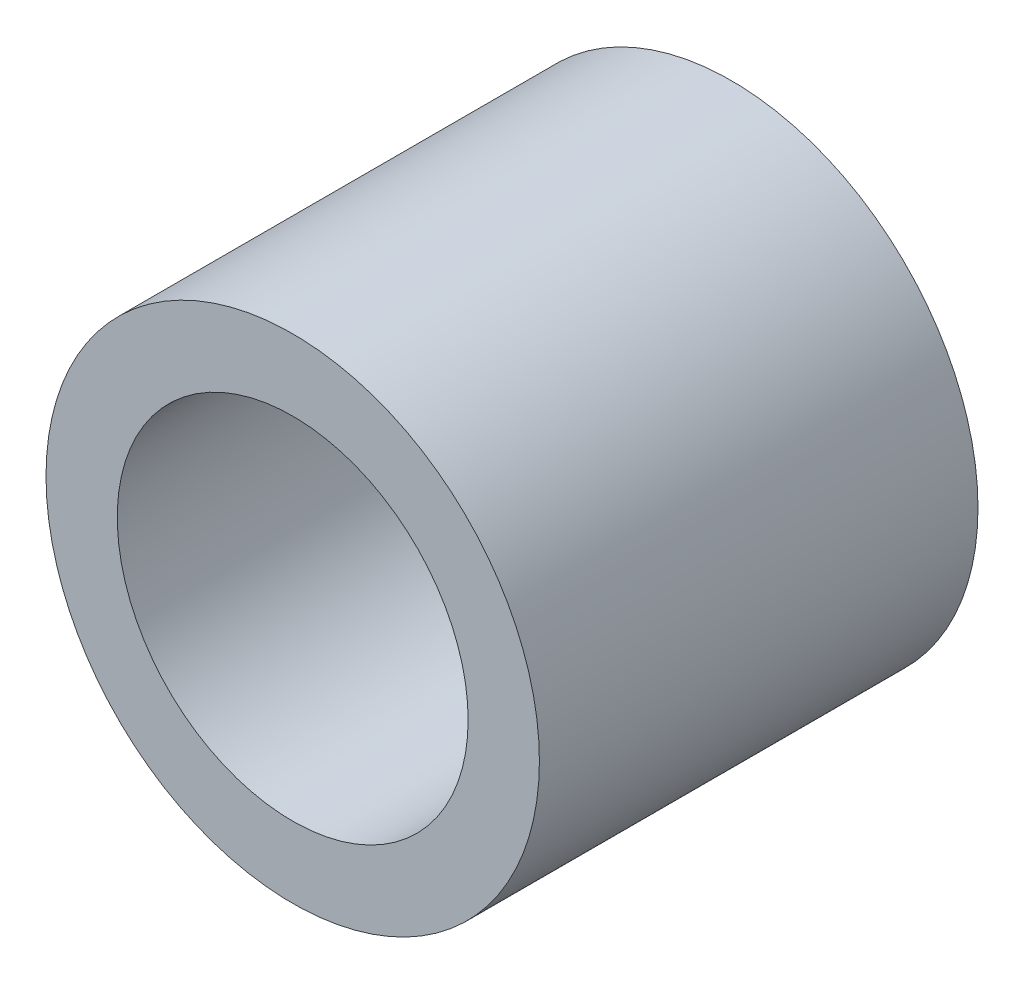
ISO-10303-21;
HEADER;
FILE_DESCRIPTION(('STEP AP214'),'2;1');
FILE_NAME('part.step','',(''),(''),'','','');
FILE_SCHEMA(('AUTOMOTIVE_DESIGN { 1 0 10303 214 1 1 1 1 }'));
ENDSEC;
DATA;
#1=APPLICATION_CONTEXT('core data for automotive mechanical design processes');
#2=APPLICATION_PROTOCOL_DEFINITION('international standard','automotive_design',2000,#1);
#3=PRODUCT_CONTEXT('',#1,'mechanical');
#4=PRODUCT('Part','Part','',(#3));
#5=PRODUCT_RELATED_PRODUCT_CATEGORY('part','',(#4));
#6=PRODUCT_DEFINITION_FORMATION('','',#4);
#7=PRODUCT_DEFINITION_CONTEXT('part definition',#1,'design');
#8=PRODUCT_DEFINITION('design','',#6,#7);
#9=PRODUCT_DEFINITION_SHAPE('','',#8);
#10=(LENGTH_UNIT() NAMED_UNIT(*) SI_UNIT(.MILLI.,.METRE.));
#11=(NAMED_UNIT(*) PLANE_ANGLE_UNIT() SI_UNIT($,.RADIAN.));
#12=(NAMED_UNIT(*) SI_UNIT($,.STERADIAN.) SOLID_ANGLE_UNIT());
#13=UNCERTAINTY_MEASURE_WITH_UNIT(LENGTH_MEASURE(1.E-05),#10,'distance_accuracy_value','');
#14=(GEOMETRIC_REPRESENTATION_CONTEXT(3) GLOBAL_UNCERTAINTY_ASSIGNED_CONTEXT((#13)) GLOBAL_UNIT_ASSIGNED_CONTEXT((#10,
#11,#12)) REPRESENTATION_CONTEXT('',''));
#15=CARTESIAN_POINT('',(0.,0.,0.));
#16=DIRECTION('',(0.,0.,1.));
#17=DIRECTION('',(1.,0.,0.));
#18=AXIS2_PLACEMENT_3D('',#15,#16,#17);
#19=CARTESIAN_POINT('',(0.,0.,4.));
#20=DIRECTION('',(0.,0.,1.));
#21=DIRECTION('',(1.,0.,0.));
#22=AXIS2_PLACEMENT_3D('',#19,#20,#21);
#23=PLANE('',#22);
#24=CARTESIAN_POINT('',(0.,0.,4.));
#25=DIRECTION('',(0.,0.,1.));
#26=DIRECTION('',(1.,0.,0.));
#27=AXIS2_PLACEMENT_3D('',#24,#25,#26);
#28=CIRCLE('',#27,2.25);
#29=CARTESIAN_POINT('',(2.25,0.,4.));
#30=VERTEX_POINT('',#29);
#31=EDGE_CURVE('E10',#30,#30,#28,.T.);
#32=ORIENTED_EDGE('',*,*,#31,.T.);
#33=EDGE_LOOP('',(#32));
#34=FACE_BOUND('',#33,.T.);
#35=CARTESIAN_POINT('',(0.,0.,4.));
#36=DIRECTION('',(0.,0.,1.));
#37=DIRECTION('',(1.,0.,0.));
#38=AXIS2_PLACEMENT_3D('',#35,#36,#37);
#39=CIRCLE('',#38,1.6);
#40=CARTESIAN_POINT('',(1.6,0.,4.));
#41=VERTEX_POINT('',#40);
#42=EDGE_CURVE('E42',#41,#41,#39,.T.);
#43=ORIENTED_EDGE('',*,*,#42,.F.);
#44=EDGE_LOOP('',(#43));
#45=FACE_BOUND('',#44,.T.);
#46=ADVANCED_FACE('F31',(#34,#45),#23,.T.);
#47=CARTESIAN_POINT('',(0.,0.,0.));
#48=DIRECTION('',(0.,0.,1.));
#49=DIRECTION('',(1.,0.,0.));
#50=AXIS2_PLACEMENT_3D('',#47,#48,#49);
#51=PLANE('',#50);
#52=CARTESIAN_POINT('',(0.,0.,0.));
#53=DIRECTION('',(0.,0.,1.));
#54=DIRECTION('',(1.,0.,0.));
#55=AXIS2_PLACEMENT_3D('',#52,#53,#54);
#56=CIRCLE('',#55,2.25);
#57=CARTESIAN_POINT('',(2.25,0.,0.));
#58=VERTEX_POINT('',#57);
#59=EDGE_CURVE('E35',#58,#58,#56,.T.);
#60=ORIENTED_EDGE('',*,*,#59,.F.);
#61=EDGE_LOOP('',(#60));
#62=FACE_BOUND('',#61,.T.);
#63=CARTESIAN_POINT('',(0.,0.,0.));
#64=DIRECTION('',(0.,0.,1.));
#65=DIRECTION('',(1.,0.,0.));
#66=AXIS2_PLACEMENT_3D('',#63,#64,#65);
#67=CIRCLE('',#66,1.6);
#68=CARTESIAN_POINT('',(1.6,0.,0.));
#69=VERTEX_POINT('',#68);
#70=EDGE_CURVE('E44',#69,#69,#67,.T.);
#71=ORIENTED_EDGE('',*,*,#70,.T.);
#72=EDGE_LOOP('',(#71));
#73=FACE_BOUND('',#72,.T.);
#74=ADVANCED_FACE('F54',(#62,#73),#51,.F.);
#75=CARTESIAN_POINT('',(0.,0.,4.));
#76=DIRECTION('',(0.,0.,-1.));
#77=DIRECTION('',(-1.,0.,0.));
#78=AXIS2_PLACEMENT_3D('',#75,#76,#77);
#79=CYLINDRICAL_SURFACE('',#78,2.25);
#80=ORIENTED_EDGE('',*,*,#31,.F.);
#81=EDGE_LOOP('',(#80));
#82=FACE_BOUND('',#81,.T.);
#83=ORIENTED_EDGE('',*,*,#59,.T.);
#84=EDGE_LOOP('',(#83));
#85=FACE_BOUND('',#84,.T.);
#86=ADVANCED_FACE('F33',(#82,#85),#79,.T.);
#87=CARTESIAN_POINT('',(0.,0.,4.));
#88=DIRECTION('',(0.,0.,-1.));
#89=DIRECTION('',(-1.,0.,0.));
#90=AXIS2_PLACEMENT_3D('',#87,#88,#89);
#91=CYLINDRICAL_SURFACE('',#90,1.6);
#92=ORIENTED_EDGE('',*,*,#42,.T.);
#93=EDGE_LOOP('',(#92));
#94=FACE_BOUND('',#93,.T.);
#95=ORIENTED_EDGE('',*,*,#70,.F.);
#96=EDGE_LOOP('',(#95));
#97=FACE_BOUND('',#96,.T.);
#98=ADVANCED_FACE('F50',(#94,#97),#91,.F.);
#99=CLOSED_SHELL('',(#46,#74,#86,#98));
#100=MANIFOLD_SOLID_BREP('B2',#99);
#101=ADVANCED_BREP_SHAPE_REPRESENTATION('',(#18,#100),#14);
#102=SHAPE_DEFINITION_REPRESENTATION(#9,#101);
ENDSEC;
END-ISO-10303-21;
